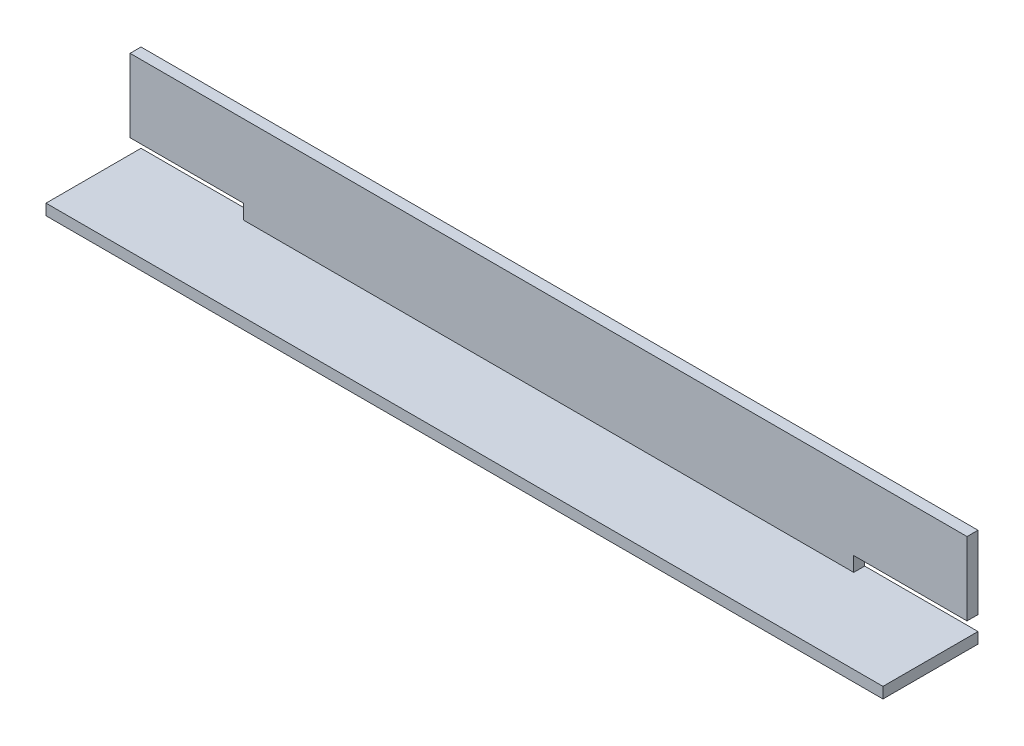
ISO-10303-21;
HEADER;
FILE_DESCRIPTION(('STEP AP214'),'2;1');
FILE_NAME('part.step','',(''),(''),'','','');
FILE_SCHEMA(('AUTOMOTIVE_DESIGN { 1 0 10303 214 1 1 1 1 }'));
ENDSEC;
DATA;
#1=APPLICATION_CONTEXT('core data for automotive mechanical design processes');
#2=APPLICATION_PROTOCOL_DEFINITION('international standard','automotive_design',2000,#1);
#3=PRODUCT_CONTEXT('',#1,'mechanical');
#4=PRODUCT('Part','Part','',(#3));
#5=PRODUCT_RELATED_PRODUCT_CATEGORY('part','',(#4));
#6=PRODUCT_DEFINITION_FORMATION('','',#4);
#7=PRODUCT_DEFINITION_CONTEXT('part definition',#1,'design');
#8=PRODUCT_DEFINITION('design','',#6,#7);
#9=PRODUCT_DEFINITION_SHAPE('','',#8);
#10=(LENGTH_UNIT() NAMED_UNIT(*) SI_UNIT(.MILLI.,.METRE.));
#11=(NAMED_UNIT(*) PLANE_ANGLE_UNIT() SI_UNIT($,.RADIAN.));
#12=(NAMED_UNIT(*) SI_UNIT($,.STERADIAN.) SOLID_ANGLE_UNIT());
#13=UNCERTAINTY_MEASURE_WITH_UNIT(LENGTH_MEASURE(1.E-05),#10,'distance_accuracy_value','');
#14=(GEOMETRIC_REPRESENTATION_CONTEXT(3) GLOBAL_UNCERTAINTY_ASSIGNED_CONTEXT((#13)) GLOBAL_UNIT_ASSIGNED_CONTEXT((#10,
#11,#12)) REPRESENTATION_CONTEXT('',''));
#15=CARTESIAN_POINT('',(0.,0.,0.));
#16=DIRECTION('',(0.,0.,1.));
#17=DIRECTION('',(1.,0.,0.));
#18=AXIS2_PLACEMENT_3D('',#15,#16,#17);
#19=CARTESIAN_POINT('',(0.,3.,0.));
#20=DIRECTION('',(-1.,0.,0.));
#21=DIRECTION('',(0.,0.,1.));
#22=AXIS2_PLACEMENT_3D('',#19,#20,#21);
#23=PLANE('',#22);
#24=DIRECTION('',(0.,-1.,0.));
#25=VECTOR('',#24,1.);
#26=CARTESIAN_POINT('',(0.,3.,0.));
#27=LINE('',#26,#25);
#28=CARTESIAN_POINT('',(0.,3.,0.));
#29=VERTEX_POINT('',#28);
#30=CARTESIAN_POINT('',(0.,0.,0.));
#31=VERTEX_POINT('',#30);
#32=EDGE_CURVE('E47',#29,#31,#27,.T.);
#33=ORIENTED_EDGE('',*,*,#32,.F.);
#34=DIRECTION('',(0.,0.,-1.));
#35=VECTOR('',#34,1.);
#36=CARTESIAN_POINT('',(0.,3.,0.));
#37=LINE('',#36,#35);
#38=CARTESIAN_POINT('',(0.,3.,26.));
#39=VERTEX_POINT('',#38);
#40=EDGE_CURVE('E93',#39,#29,#37,.T.);
#41=ORIENTED_EDGE('',*,*,#40,.F.);
#42=DIRECTION('',(0.,-1.,0.));
#43=VECTOR('',#42,1.);
#44=CARTESIAN_POINT('',(0.,3.,26.));
#45=LINE('',#44,#43);
#46=CARTESIAN_POINT('',(0.,0.,26.));
#47=VERTEX_POINT('',#46);
#48=EDGE_CURVE('E85',#39,#47,#45,.T.);
#49=ORIENTED_EDGE('',*,*,#48,.T.);
#50=DIRECTION('',(0.,0.,-1.));
#51=VECTOR('',#50,1.);
#52=CARTESIAN_POINT('',(0.,0.,0.));
#53=LINE('',#52,#51);
#54=EDGE_CURVE('E99',#47,#31,#53,.T.);
#55=ORIENTED_EDGE('',*,*,#54,.T.);
#56=EDGE_LOOP('',(#33,#41,#49,#55));
#57=FACE_BOUND('',#56,.T.);
#58=ADVANCED_FACE('F38',(#57),#23,.F.);
#59=CARTESIAN_POINT('',(-229.,3.,0.));
#60=DIRECTION('',(1.,0.,0.));
#61=DIRECTION('',(0.,0.,-1.));
#62=AXIS2_PLACEMENT_3D('',#59,#60,#61);
#63=PLANE('',#62);
#64=DIRECTION('',(0.,-1.,0.));
#65=VECTOR('',#64,1.);
#66=CARTESIAN_POINT('',(-229.,3.,0.));
#67=LINE('',#66,#65);
#68=CARTESIAN_POINT('',(-229.,27.,0.));
#69=VERTEX_POINT('',#68);
#70=CARTESIAN_POINT('',(-229.,7.,0.));
#71=VERTEX_POINT('',#70);
#72=EDGE_CURVE('E122',#69,#71,#67,.T.);
#73=ORIENTED_EDGE('',*,*,#72,.T.);
#74=DIRECTION('',(0.,0.,1.));
#75=VECTOR('',#74,1.);
#76=CARTESIAN_POINT('',(-229.,7.,-21.));
#77=LINE('',#76,#75);
#78=CARTESIAN_POINT('',(-229.,7.,3.));
#79=VERTEX_POINT('',#78);
#80=EDGE_CURVE('E227',#71,#79,#77,.T.);
#81=ORIENTED_EDGE('',*,*,#80,.T.);
#82=DIRECTION('',(0.,-1.,0.));
#83=VECTOR('',#82,1.);
#84=CARTESIAN_POINT('',(-229.,27.,3.));
#85=LINE('',#84,#83);
#86=CARTESIAN_POINT('',(-229.,27.,3.));
#87=VERTEX_POINT('',#86);
#88=EDGE_CURVE('E107',#87,#79,#85,.T.);
#89=ORIENTED_EDGE('',*,*,#88,.F.);
#90=DIRECTION('',(0.,0.,1.));
#91=VECTOR('',#90,1.);
#92=CARTESIAN_POINT('',(-229.,27.,0.));
#93=LINE('',#92,#91);
#94=EDGE_CURVE('E180',#69,#87,#93,.T.);
#95=ORIENTED_EDGE('',*,*,#94,.F.);
#96=EDGE_LOOP('',(#73,#81,#89,#95));
#97=FACE_BOUND('',#96,.T.);
#98=ADVANCED_FACE('F186',(#97),#63,.F.);
#99=CARTESIAN_POINT('',(0.,3.,0.));
#100=DIRECTION('',(0.,-1.,0.));
#101=DIRECTION('',(0.,0.,-1.));
#102=AXIS2_PLACEMENT_3D('',#99,#100,#101);
#103=PLANE('',#102);
#104=DIRECTION('',(1.,0.,0.));
#105=VECTOR('',#104,1.);
#106=CARTESIAN_POINT('',(-229.,3.,3.));
#107=LINE('',#106,#105);
#108=CARTESIAN_POINT('',(-198.,3.,3.));
#109=VERTEX_POINT('',#108);
#110=CARTESIAN_POINT('',(-31.,3.,3.));
#111=VERTEX_POINT('',#110);
#112=EDGE_CURVE('E189',#109,#111,#107,.T.);
#113=ORIENTED_EDGE('',*,*,#112,.F.);
#114=DIRECTION('',(0.,0.,1.));
#115=VECTOR('',#114,1.);
#116=CARTESIAN_POINT('',(-198.,3.,-21.));
#117=LINE('',#116,#115);
#118=CARTESIAN_POINT('',(-198.,3.,0.));
#119=VERTEX_POINT('',#118);
#120=EDGE_CURVE('E212',#119,#109,#117,.T.);
#121=ORIENTED_EDGE('',*,*,#120,.F.);
#122=DIRECTION('',(1.,0.,0.));
#123=VECTOR('',#122,1.);
#124=CARTESIAN_POINT('',(0.,3.,0.));
#125=LINE('',#124,#123);
#126=CARTESIAN_POINT('',(-229.,3.,0.));
#127=VERTEX_POINT('',#126);
#128=EDGE_CURVE('E210',#127,#119,#125,.T.);
#129=ORIENTED_EDGE('',*,*,#128,.F.);
#130=DIRECTION('',(0.,0.,1.));
#131=VECTOR('',#130,1.);
#132=CARTESIAN_POINT('',(-229.,3.,0.));
#133=LINE('',#132,#131);
#134=CARTESIAN_POINT('',(-229.,3.,26.));
#135=VERTEX_POINT('',#134);
#136=EDGE_CURVE('E137',#127,#135,#133,.T.);
#137=ORIENTED_EDGE('',*,*,#136,.T.);
#138=DIRECTION('',(1.,0.,0.));
#139=VECTOR('',#138,1.);
#140=CARTESIAN_POINT('',(0.,3.,26.));
#141=LINE('',#140,#139);
#142=EDGE_CURVE('E63',#135,#39,#141,.T.);
#143=ORIENTED_EDGE('',*,*,#142,.T.);
#144=ORIENTED_EDGE('',*,*,#40,.T.);
#145=DIRECTION('',(1.,0.,0.));
#146=VECTOR('',#145,1.);
#147=CARTESIAN_POINT('',(0.,3.,0.));
#148=LINE('',#147,#146);
#149=CARTESIAN_POINT('',(-31.,3.,0.));
#150=VERTEX_POINT('',#149);
#151=EDGE_CURVE('E147',#150,#29,#148,.T.);
#152=ORIENTED_EDGE('',*,*,#151,.F.);
#153=DIRECTION('',(0.,0.,1.));
#154=VECTOR('',#153,1.);
#155=CARTESIAN_POINT('',(-31.,3.,-21.));
#156=LINE('',#155,#154);
#157=EDGE_CURVE('E235',#150,#111,#156,.T.);
#158=ORIENTED_EDGE('',*,*,#157,.T.);
#159=EDGE_LOOP('',(#113,#121,#129,#137,#143,#144,#152,#158));
#160=FACE_BOUND('',#159,.T.);
#161=ADVANCED_FACE('F208',(#160),#103,.F.);
#162=DIRECTION('',(0.,-1.,0.));
#163=VECTOR('',#162,1.);
#164=CARTESIAN_POINT('',(0.,27.,3.));
#165=LINE('',#164,#163);
#166=CARTESIAN_POINT('',(0.,27.,3.));
#167=VERTEX_POINT('',#166);
#168=CARTESIAN_POINT('',(0.,7.,3.));
#169=VERTEX_POINT('',#168);
#170=EDGE_CURVE('E113',#167,#169,#165,.T.);
#171=ORIENTED_EDGE('',*,*,#170,.T.);
#172=DIRECTION('',(0.,0.,1.));
#173=VECTOR('',#172,1.);
#174=CARTESIAN_POINT('',(0.,7.,-21.));
#175=LINE('',#174,#173);
#176=CARTESIAN_POINT('',(0.,7.,0.));
#177=VERTEX_POINT('',#176);
#178=EDGE_CURVE('E54',#177,#169,#175,.T.);
#179=ORIENTED_EDGE('',*,*,#178,.F.);
#180=CARTESIAN_POINT('',(0.,27.,0.));
#181=VERTEX_POINT('',#180);
#182=EDGE_CURVE('E11',#181,#177,#27,.T.);
#183=ORIENTED_EDGE('',*,*,#182,.F.);
#184=DIRECTION('',(0.,0.,-1.));
#185=VECTOR('',#184,1.);
#186=CARTESIAN_POINT('',(0.,27.,0.));
#187=LINE('',#186,#185);
#188=EDGE_CURVE('E183',#167,#181,#187,.T.);
#189=ORIENTED_EDGE('',*,*,#188,.F.);
#190=EDGE_LOOP('',(#171,#179,#183,#189));
#191=FACE_BOUND('',#190,.T.);
#192=ADVANCED_FACE('F40',(#191),#23,.F.);
#193=CARTESIAN_POINT('',(0.,3.,0.));
#194=DIRECTION('',(0.,0.,1.));
#195=DIRECTION('',(1.,0.,0.));
#196=AXIS2_PLACEMENT_3D('',#193,#194,#195);
#197=PLANE('',#196);
#198=DIRECTION('',(0.,1.,0.));
#199=VECTOR('',#198,1.);
#200=CARTESIAN_POINT('',(-198.,3.,0.));
#201=LINE('',#200,#199);
#202=CARTESIAN_POINT('',(-198.,7.,0.));
#203=VERTEX_POINT('',#202);
#204=EDGE_CURVE('E214',#119,#203,#201,.T.);
#205=ORIENTED_EDGE('',*,*,#204,.T.);
#206=DIRECTION('',(-1.,0.,0.));
#207=VECTOR('',#206,1.);
#208=CARTESIAN_POINT('',(0.,7.,0.));
#209=LINE('',#208,#207);
#210=EDGE_CURVE('E175',#203,#71,#209,.T.);
#211=ORIENTED_EDGE('',*,*,#210,.T.);
#212=ORIENTED_EDGE('',*,*,#72,.F.);
#213=DIRECTION('',(-1.,0.,0.));
#214=VECTOR('',#213,1.);
#215=CARTESIAN_POINT('',(-229.,27.,0.));
#216=LINE('',#215,#214);
#217=EDGE_CURVE('E174',#181,#69,#216,.T.);
#218=ORIENTED_EDGE('',*,*,#217,.F.);
#219=ORIENTED_EDGE('',*,*,#182,.T.);
#220=DIRECTION('',(-1.,0.,0.));
#221=VECTOR('',#220,1.);
#222=CARTESIAN_POINT('',(0.,7.,0.));
#223=LINE('',#222,#221);
#224=CARTESIAN_POINT('',(-31.,7.,0.));
#225=VERTEX_POINT('',#224);
#226=EDGE_CURVE('E223',#177,#225,#223,.T.);
#227=ORIENTED_EDGE('',*,*,#226,.T.);
#228=DIRECTION('',(0.,-1.,0.));
#229=VECTOR('',#228,1.);
#230=CARTESIAN_POINT('',(-31.,3.,0.));
#231=LINE('',#230,#229);
#232=EDGE_CURVE('E218',#225,#150,#231,.T.);
#233=ORIENTED_EDGE('',*,*,#232,.T.);
#234=ORIENTED_EDGE('',*,*,#151,.T.);
#235=ORIENTED_EDGE('',*,*,#32,.T.);
#236=DIRECTION('',(-1.,0.,0.));
#237=VECTOR('',#236,1.);
#238=CARTESIAN_POINT('',(0.,0.,0.));
#239=LINE('',#238,#237);
#240=CARTESIAN_POINT('',(-229.,0.,0.));
#241=VERTEX_POINT('',#240);
#242=EDGE_CURVE('E105',#31,#241,#239,.T.);
#243=ORIENTED_EDGE('',*,*,#242,.T.);
#244=EDGE_CURVE('E121',#127,#241,#67,.T.);
#245=ORIENTED_EDGE('',*,*,#244,.F.);
#246=ORIENTED_EDGE('',*,*,#128,.T.);
#247=EDGE_LOOP('',(#205,#211,#212,#218,#219,#227,#233,#234,#235,#243,#245,#246));
#248=FACE_BOUND('',#247,.T.);
#249=ADVANCED_FACE('F142',(#248),#197,.F.);
#250=ORIENTED_EDGE('',*,*,#136,.F.);
#251=ORIENTED_EDGE('',*,*,#244,.T.);
#252=DIRECTION('',(0.,0.,1.));
#253=VECTOR('',#252,1.);
#254=CARTESIAN_POINT('',(-229.,0.,0.));
#255=LINE('',#254,#253);
#256=CARTESIAN_POINT('',(-229.,0.,26.));
#257=VERTEX_POINT('',#256);
#258=EDGE_CURVE('E94',#241,#257,#255,.T.);
#259=ORIENTED_EDGE('',*,*,#258,.T.);
#260=DIRECTION('',(0.,-1.,0.));
#261=VECTOR('',#260,1.);
#262=CARTESIAN_POINT('',(-229.,3.,26.));
#263=LINE('',#262,#261);
#264=EDGE_CURVE('E88',#135,#257,#263,.T.);
#265=ORIENTED_EDGE('',*,*,#264,.F.);
#266=EDGE_LOOP('',(#250,#251,#259,#265));
#267=FACE_BOUND('',#266,.T.);
#268=ADVANCED_FACE('F135',(#267),#63,.F.);
#269=CARTESIAN_POINT('',(0.,3.,26.));
#270=DIRECTION('',(0.,0.,-1.));
#271=DIRECTION('',(-1.,0.,0.));
#272=AXIS2_PLACEMENT_3D('',#269,#270,#271);
#273=PLANE('',#272);
#274=DIRECTION('',(1.,0.,0.));
#275=VECTOR('',#274,1.);
#276=CARTESIAN_POINT('',(0.,0.,26.));
#277=LINE('',#276,#275);
#278=EDGE_CURVE('E82',#257,#47,#277,.T.);
#279=ORIENTED_EDGE('',*,*,#278,.T.);
#280=ORIENTED_EDGE('',*,*,#48,.F.);
#281=ORIENTED_EDGE('',*,*,#142,.F.);
#282=ORIENTED_EDGE('',*,*,#264,.T.);
#283=EDGE_LOOP('',(#279,#280,#281,#282));
#284=FACE_BOUND('',#283,.T.);
#285=ADVANCED_FACE('F84',(#284),#273,.F.);
#286=CARTESIAN_POINT('',(0.,0.,0.));
#287=DIRECTION('',(0.,-1.,0.));
#288=DIRECTION('',(0.,0.,-1.));
#289=AXIS2_PLACEMENT_3D('',#286,#287,#288);
#290=PLANE('',#289);
#291=ORIENTED_EDGE('',*,*,#54,.F.);
#292=ORIENTED_EDGE('',*,*,#278,.F.);
#293=ORIENTED_EDGE('',*,*,#258,.F.);
#294=ORIENTED_EDGE('',*,*,#242,.F.);
#295=EDGE_LOOP('',(#291,#292,#293,#294));
#296=FACE_BOUND('',#295,.T.);
#297=ADVANCED_FACE('F103',(#296),#290,.T.);
#298=CARTESIAN_POINT('',(-229.,27.,3.));
#299=DIRECTION('',(0.,0.,-1.));
#300=DIRECTION('',(-1.,0.,0.));
#301=AXIS2_PLACEMENT_3D('',#298,#299,#300);
#302=PLANE('',#301);
#303=ORIENTED_EDGE('',*,*,#88,.T.);
#304=DIRECTION('',(-1.,0.,0.));
#305=VECTOR('',#304,1.);
#306=CARTESIAN_POINT('',(-229.,7.,3.));
#307=LINE('',#306,#305);
#308=CARTESIAN_POINT('',(-198.,7.,3.));
#309=VERTEX_POINT('',#308);
#310=EDGE_CURVE('E249',#309,#79,#307,.T.);
#311=ORIENTED_EDGE('',*,*,#310,.F.);
#312=DIRECTION('',(0.,1.,0.));
#313=VECTOR('',#312,1.);
#314=CARTESIAN_POINT('',(-198.,3.,3.));
#315=LINE('',#314,#313);
#316=EDGE_CURVE('E239',#109,#309,#315,.T.);
#317=ORIENTED_EDGE('',*,*,#316,.F.);
#318=ORIENTED_EDGE('',*,*,#112,.T.);
#319=DIRECTION('',(0.,-1.,0.));
#320=VECTOR('',#319,1.);
#321=CARTESIAN_POINT('',(-31.,3.,3.));
#322=LINE('',#321,#320);
#323=CARTESIAN_POINT('',(-31.,7.,3.));
#324=VERTEX_POINT('',#323);
#325=EDGE_CURVE('E231',#324,#111,#322,.T.);
#326=ORIENTED_EDGE('',*,*,#325,.F.);
#327=DIRECTION('',(-1.,0.,0.));
#328=VECTOR('',#327,1.);
#329=CARTESIAN_POINT('',(0.,7.,3.));
#330=LINE('',#329,#328);
#331=EDGE_CURVE('E243',#169,#324,#330,.T.);
#332=ORIENTED_EDGE('',*,*,#331,.F.);
#333=ORIENTED_EDGE('',*,*,#170,.F.);
#334=DIRECTION('',(1.,0.,0.));
#335=VECTOR('',#334,1.);
#336=CARTESIAN_POINT('',(-229.,27.,3.));
#337=LINE('',#336,#335);
#338=EDGE_CURVE('E188',#87,#167,#337,.T.);
#339=ORIENTED_EDGE('',*,*,#338,.F.);
#340=EDGE_LOOP('',(#303,#311,#317,#318,#326,#332,#333,#339));
#341=FACE_BOUND('',#340,.T.);
#342=ADVANCED_FACE('F270',(#341),#302,.F.);
#343=CARTESIAN_POINT('',(0.,27.,0.));
#344=DIRECTION('',(0.,1.,0.));
#345=DIRECTION('',(0.,0.,1.));
#346=AXIS2_PLACEMENT_3D('',#343,#344,#345);
#347=PLANE('',#346);
#348=ORIENTED_EDGE('',*,*,#94,.T.);
#349=ORIENTED_EDGE('',*,*,#338,.T.);
#350=ORIENTED_EDGE('',*,*,#188,.T.);
#351=ORIENTED_EDGE('',*,*,#217,.T.);
#352=EDGE_LOOP('',(#348,#349,#350,#351));
#353=FACE_BOUND('',#352,.T.);
#354=ADVANCED_FACE('F179',(#353),#347,.T.);
#355=CARTESIAN_POINT('',(-31.,3.,-21.));
#356=DIRECTION('',(-1.,0.,0.));
#357=DIRECTION('',(0.,0.,1.));
#358=AXIS2_PLACEMENT_3D('',#355,#356,#357);
#359=PLANE('',#358);
#360=DIRECTION('',(0.,0.,1.));
#361=VECTOR('',#360,1.);
#362=CARTESIAN_POINT('',(-31.,7.,-21.));
#363=LINE('',#362,#361);
#364=EDGE_CURVE('E230',#225,#324,#363,.T.);
#365=ORIENTED_EDGE('',*,*,#364,.T.);
#366=ORIENTED_EDGE('',*,*,#325,.T.);
#367=ORIENTED_EDGE('',*,*,#157,.F.);
#368=ORIENTED_EDGE('',*,*,#232,.F.);
#369=EDGE_LOOP('',(#365,#366,#367,#368));
#370=FACE_BOUND('',#369,.T.);
#371=ADVANCED_FACE('F285',(#370),#359,.F.);
#372=CARTESIAN_POINT('',(0.,7.,-21.));
#373=DIRECTION('',(0.,1.,0.));
#374=DIRECTION('',(-1.,0.,0.));
#375=AXIS2_PLACEMENT_3D('',#372,#373,#374);
#376=PLANE('',#375);
#377=ORIENTED_EDGE('',*,*,#178,.T.);
#378=ORIENTED_EDGE('',*,*,#331,.T.);
#379=ORIENTED_EDGE('',*,*,#364,.F.);
#380=ORIENTED_EDGE('',*,*,#226,.F.);
#381=EDGE_LOOP('',(#377,#378,#379,#380));
#382=FACE_BOUND('',#381,.T.);
#383=ADVANCED_FACE('F286',(#382),#376,.F.);
#384=CARTESIAN_POINT('',(-229.,7.,-21.));
#385=DIRECTION('',(0.,1.,0.));
#386=DIRECTION('',(0.,0.,1.));
#387=AXIS2_PLACEMENT_3D('',#384,#385,#386);
#388=PLANE('',#387);
#389=DIRECTION('',(0.,0.,1.));
#390=VECTOR('',#389,1.);
#391=CARTESIAN_POINT('',(-198.,7.,-21.));
#392=LINE('',#391,#390);
#393=EDGE_CURVE('E248',#203,#309,#392,.T.);
#394=ORIENTED_EDGE('',*,*,#393,.T.);
#395=ORIENTED_EDGE('',*,*,#310,.T.);
#396=ORIENTED_EDGE('',*,*,#80,.F.);
#397=ORIENTED_EDGE('',*,*,#210,.F.);
#398=EDGE_LOOP('',(#394,#395,#396,#397));
#399=FACE_BOUND('',#398,.T.);
#400=ADVANCED_FACE('F272',(#399),#388,.F.);
#401=CARTESIAN_POINT('',(-198.,3.,-21.));
#402=DIRECTION('',(1.,0.,0.));
#403=DIRECTION('',(0.,0.,-1.));
#404=AXIS2_PLACEMENT_3D('',#401,#402,#403);
#405=PLANE('',#404);
#406=ORIENTED_EDGE('',*,*,#120,.T.);
#407=ORIENTED_EDGE('',*,*,#316,.T.);
#408=ORIENTED_EDGE('',*,*,#393,.F.);
#409=ORIENTED_EDGE('',*,*,#204,.F.);
#410=EDGE_LOOP('',(#406,#407,#408,#409));
#411=FACE_BOUND('',#410,.T.);
#412=ADVANCED_FACE('F265',(#411),#405,.F.);
#413=CLOSED_SHELL('',(#58,#98,#161,#192,#249,#268,#285,#297,#342,#354,#371,#383,#400,#412));
#414=MANIFOLD_SOLID_BREP('B2',#413);
#415=ADVANCED_BREP_SHAPE_REPRESENTATION('',(#18,#414),#14);
#416=SHAPE_DEFINITION_REPRESENTATION(#9,#415);
ENDSEC;
END-ISO-10303-21;
